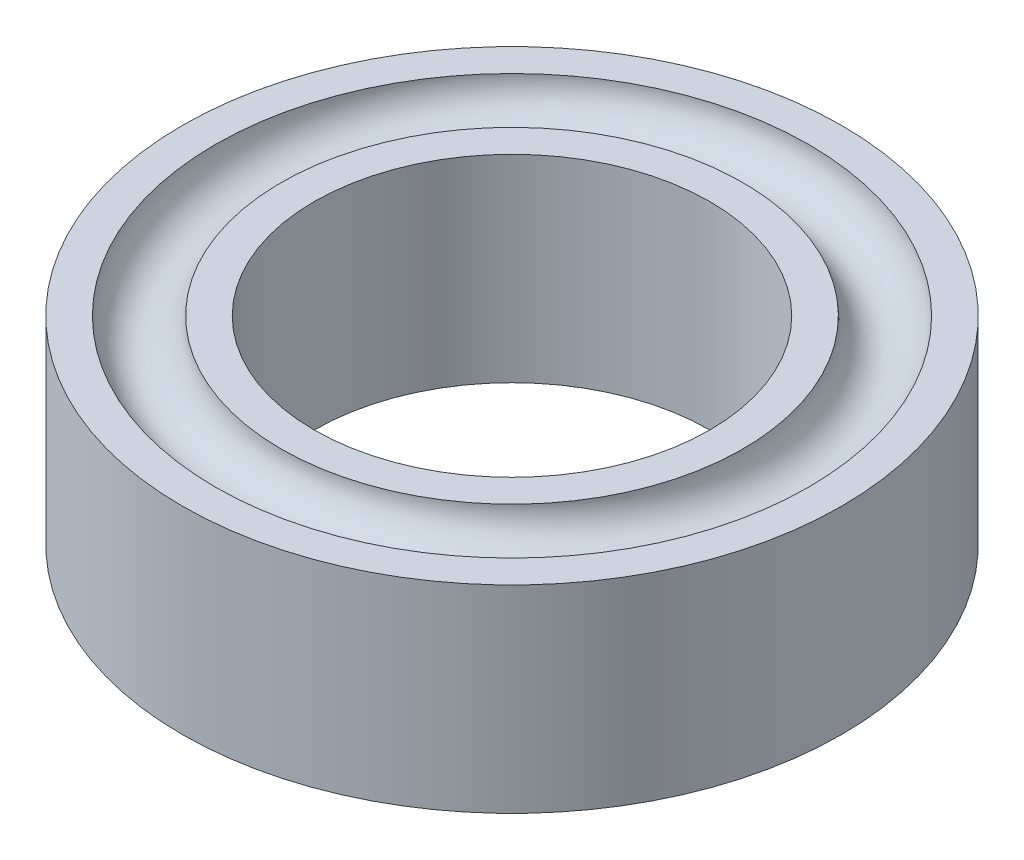
ISO-10303-21;
HEADER;
FILE_DESCRIPTION(('STEP AP214'),'2;1');
FILE_NAME('part.step','',(''),(''),'','','');
FILE_SCHEMA(('AUTOMOTIVE_DESIGN { 1 0 10303 214 1 1 1 1 }'));
ENDSEC;
DATA;
#1=APPLICATION_CONTEXT('core data for automotive mechanical design processes');
#2=APPLICATION_PROTOCOL_DEFINITION('international standard','automotive_design',2000,#1);
#3=PRODUCT_CONTEXT('',#1,'mechanical');
#4=PRODUCT('Part','Part','',(#3));
#5=PRODUCT_RELATED_PRODUCT_CATEGORY('part','',(#4));
#6=PRODUCT_DEFINITION_FORMATION('','',#4);
#7=PRODUCT_DEFINITION_CONTEXT('part definition',#1,'design');
#8=PRODUCT_DEFINITION('design','',#6,#7);
#9=PRODUCT_DEFINITION_SHAPE('','',#8);
#10=(LENGTH_UNIT() NAMED_UNIT(*) SI_UNIT(.MILLI.,.METRE.));
#11=(NAMED_UNIT(*) PLANE_ANGLE_UNIT() SI_UNIT($,.RADIAN.));
#12=(NAMED_UNIT(*) SI_UNIT($,.STERADIAN.) SOLID_ANGLE_UNIT());
#13=UNCERTAINTY_MEASURE_WITH_UNIT(LENGTH_MEASURE(1.E-05),#10,'distance_accuracy_value','');
#14=(GEOMETRIC_REPRESENTATION_CONTEXT(3) GLOBAL_UNCERTAINTY_ASSIGNED_CONTEXT((#13)) GLOBAL_UNIT_ASSIGNED_CONTEXT((#10,
#11,#12)) REPRESENTATION_CONTEXT('',''));
#15=CARTESIAN_POINT('',(0.,0.,0.));
#16=DIRECTION('',(0.,0.,1.));
#17=DIRECTION('',(1.,0.,0.));
#18=AXIS2_PLACEMENT_3D('',#15,#16,#17);
#19=CARTESIAN_POINT('',(3.5,-1.5,0.));
#20=DIRECTION('',(0.,1.,0.));
#21=DIRECTION('',(0.,0.,1.));
#22=AXIS2_PLACEMENT_3D('',#19,#20,#21);
#23=PLANE('',#22);
#24=CARTESIAN_POINT('',(0.,-1.5,0.));
#25=DIRECTION('',(0.,1.,0.));
#26=DIRECTION('',(0.,0.,1.));
#27=AXIS2_PLACEMENT_3D('',#24,#25,#26);
#28=CIRCLE('',#27,3.);
#29=CARTESIAN_POINT('',(0.,-1.5,3.));
#30=VERTEX_POINT('',#29);
#31=EDGE_CURVE('E58',#30,#30,#28,.T.);
#32=ORIENTED_EDGE('',*,*,#31,.T.);
#33=EDGE_LOOP('',(#32));
#34=FACE_BOUND('',#33,.T.);
#35=CARTESIAN_POINT('',(0.,-1.5,0.));
#36=DIRECTION('',(0.,1.,0.));
#37=DIRECTION('',(0.,0.,1.));
#38=AXIS2_PLACEMENT_3D('',#35,#36,#37);
#39=CIRCLE('',#38,3.5);
#40=CARTESIAN_POINT('',(0.,-1.5,3.5));
#41=VERTEX_POINT('',#40);
#42=EDGE_CURVE('E10',#41,#41,#39,.T.);
#43=ORIENTED_EDGE('',*,*,#42,.F.);
#44=EDGE_LOOP('',(#43));
#45=FACE_BOUND('',#44,.T.);
#46=ADVANCED_FACE('F33',(#34,#45),#23,.F.);
#47=CARTESIAN_POINT('',(0.,-1.5,0.));
#48=DIRECTION('',(0.,1.,0.));
#49=DIRECTION('',(0.,0.,1.));
#50=AXIS2_PLACEMENT_3D('',#47,#48,#49);
#51=TOROIDAL_SURFACE('',#50,4.,0.5);
#52=CARTESIAN_POINT('',(0.,-1.5,0.));
#53=DIRECTION('',(0.,1.,0.));
#54=DIRECTION('',(0.,0.,1.));
#55=AXIS2_PLACEMENT_3D('',#52,#53,#54);
#56=CIRCLE('',#55,4.5);
#57=CARTESIAN_POINT('',(0.,-1.5,4.5));
#58=VERTEX_POINT('',#57);
#59=EDGE_CURVE('E39',#58,#58,#56,.T.);
#60=ORIENTED_EDGE('',*,*,#59,.F.);
#61=EDGE_LOOP('',(#60));
#62=FACE_BOUND('',#61,.T.);
#63=ORIENTED_EDGE('',*,*,#42,.T.);
#64=EDGE_LOOP('',(#63));
#65=FACE_BOUND('',#64,.T.);
#66=ADVANCED_FACE('F94',(#62,#65),#51,.F.);
#67=CARTESIAN_POINT('',(5.,-1.5,0.));
#68=DIRECTION('',(0.,1.,0.));
#69=DIRECTION('',(0.,0.,1.));
#70=AXIS2_PLACEMENT_3D('',#67,#68,#69);
#71=PLANE('',#70);
#72=CARTESIAN_POINT('',(0.,-1.5,0.));
#73=DIRECTION('',(0.,1.,0.));
#74=DIRECTION('',(0.,0.,1.));
#75=AXIS2_PLACEMENT_3D('',#72,#73,#74);
#76=CIRCLE('',#75,5.);
#77=CARTESIAN_POINT('',(0.,-1.5,5.));
#78=VERTEX_POINT('',#77);
#79=EDGE_CURVE('E43',#78,#78,#76,.T.);
#80=ORIENTED_EDGE('',*,*,#79,.F.);
#81=EDGE_LOOP('',(#80));
#82=FACE_BOUND('',#81,.T.);
#83=ORIENTED_EDGE('',*,*,#59,.T.);
#84=EDGE_LOOP('',(#83));
#85=FACE_BOUND('',#84,.T.);
#86=ADVANCED_FACE('F89',(#82,#85),#71,.F.);
#87=CARTESIAN_POINT('',(0.,2.01041666666667,0.));
#88=DIRECTION('',(0.,1.,0.));
#89=DIRECTION('',(0.,0.,1.));
#90=AXIS2_PLACEMENT_3D('',#87,#88,#89);
#91=CYLINDRICAL_SURFACE('',#90,5.);
#92=CARTESIAN_POINT('',(0.,1.5,0.));
#93=DIRECTION('',(0.,1.,0.));
#94=DIRECTION('',(0.,0.,1.));
#95=AXIS2_PLACEMENT_3D('',#92,#93,#94);
#96=CIRCLE('',#95,5.);
#97=CARTESIAN_POINT('',(0.,1.5,5.));
#98=VERTEX_POINT('',#97);
#99=EDGE_CURVE('E47',#98,#98,#96,.T.);
#100=ORIENTED_EDGE('',*,*,#99,.F.);
#101=EDGE_LOOP('',(#100));
#102=FACE_BOUND('',#101,.T.);
#103=ORIENTED_EDGE('',*,*,#79,.T.);
#104=EDGE_LOOP('',(#103));
#105=FACE_BOUND('',#104,.T.);
#106=ADVANCED_FACE('F83',(#102,#105),#91,.T.);
#107=CARTESIAN_POINT('',(4.5,1.5,0.));
#108=DIRECTION('',(0.,-1.,0.));
#109=DIRECTION('',(0.,0.,-1.));
#110=AXIS2_PLACEMENT_3D('',#107,#108,#109);
#111=PLANE('',#110);
#112=CARTESIAN_POINT('',(0.,1.5,0.));
#113=DIRECTION('',(0.,1.,0.));
#114=DIRECTION('',(0.,0.,1.));
#115=AXIS2_PLACEMENT_3D('',#112,#113,#114);
#116=CIRCLE('',#115,4.5);
#117=CARTESIAN_POINT('',(0.,1.5,4.5));
#118=VERTEX_POINT('',#117);
#119=EDGE_CURVE('E52',#118,#118,#116,.T.);
#120=ORIENTED_EDGE('',*,*,#119,.F.);
#121=EDGE_LOOP('',(#120));
#122=FACE_BOUND('',#121,.T.);
#123=ORIENTED_EDGE('',*,*,#99,.T.);
#124=EDGE_LOOP('',(#123));
#125=FACE_BOUND('',#124,.T.);
#126=ADVANCED_FACE('F77',(#122,#125),#111,.F.);
#127=CARTESIAN_POINT('',(0.,1.5,0.));
#128=DIRECTION('',(0.,1.,0.));
#129=DIRECTION('',(0.,0.,1.));
#130=AXIS2_PLACEMENT_3D('',#127,#128,#129);
#131=TOROIDAL_SURFACE('',#130,4.,0.5);
#132=CARTESIAN_POINT('',(0.,1.5,0.));
#133=DIRECTION('',(0.,1.,0.));
#134=DIRECTION('',(0.,0.,1.));
#135=AXIS2_PLACEMENT_3D('',#132,#133,#134);
#136=CIRCLE('',#135,3.5);
#137=CARTESIAN_POINT('',(0.,1.5,3.5));
#138=VERTEX_POINT('',#137);
#139=EDGE_CURVE('E55',#138,#138,#136,.T.);
#140=ORIENTED_EDGE('',*,*,#139,.F.);
#141=EDGE_LOOP('',(#140));
#142=FACE_BOUND('',#141,.T.);
#143=ORIENTED_EDGE('',*,*,#119,.T.);
#144=EDGE_LOOP('',(#143));
#145=FACE_BOUND('',#144,.T.);
#146=ADVANCED_FACE('F71',(#142,#145),#131,.F.);
#147=CARTESIAN_POINT('',(0.,1.5,0.));
#148=DIRECTION('',(0.,-1.,0.));
#149=DIRECTION('',(0.,0.,-1.));
#150=AXIS2_PLACEMENT_3D('',#147,#148,#149);
#151=PLANE('',#150);
#152=CARTESIAN_POINT('',(0.,1.5,0.));
#153=DIRECTION('',(0.,1.,0.));
#154=DIRECTION('',(0.,0.,1.));
#155=AXIS2_PLACEMENT_3D('',#152,#153,#154);
#156=CIRCLE('',#155,3.);
#157=CARTESIAN_POINT('',(0.,1.5,3.));
#158=VERTEX_POINT('',#157);
#159=EDGE_CURVE('E61',#158,#158,#156,.T.);
#160=ORIENTED_EDGE('',*,*,#159,.F.);
#161=EDGE_LOOP('',(#160));
#162=FACE_BOUND('',#161,.T.);
#163=ORIENTED_EDGE('',*,*,#139,.T.);
#164=EDGE_LOOP('',(#163));
#165=FACE_BOUND('',#164,.T.);
#166=ADVANCED_FACE('F68',(#162,#165),#151,.F.);
#167=CARTESIAN_POINT('',(0.,-8.5,0.));
#168=DIRECTION('',(0.,1.,0.));
#169=DIRECTION('',(0.,0.,1.));
#170=AXIS2_PLACEMENT_3D('',#167,#168,#169);
#171=CYLINDRICAL_SURFACE('',#170,3.);
#172=ORIENTED_EDGE('',*,*,#159,.T.);
#173=EDGE_LOOP('',(#172));
#174=FACE_BOUND('',#173,.T.);
#175=ORIENTED_EDGE('',*,*,#31,.F.);
#176=EDGE_LOOP('',(#175));
#177=FACE_BOUND('',#176,.T.);
#178=ADVANCED_FACE('F65',(#174,#177),#171,.F.);
#179=CLOSED_SHELL('',(#46,#66,#86,#106,#126,#146,#166,#178));
#180=MANIFOLD_SOLID_BREP('B2',#179);
#181=ADVANCED_BREP_SHAPE_REPRESENTATION('',(#18,#180),#14);
#182=SHAPE_DEFINITION_REPRESENTATION(#9,#181);
ENDSEC;
END-ISO-10303-21;
